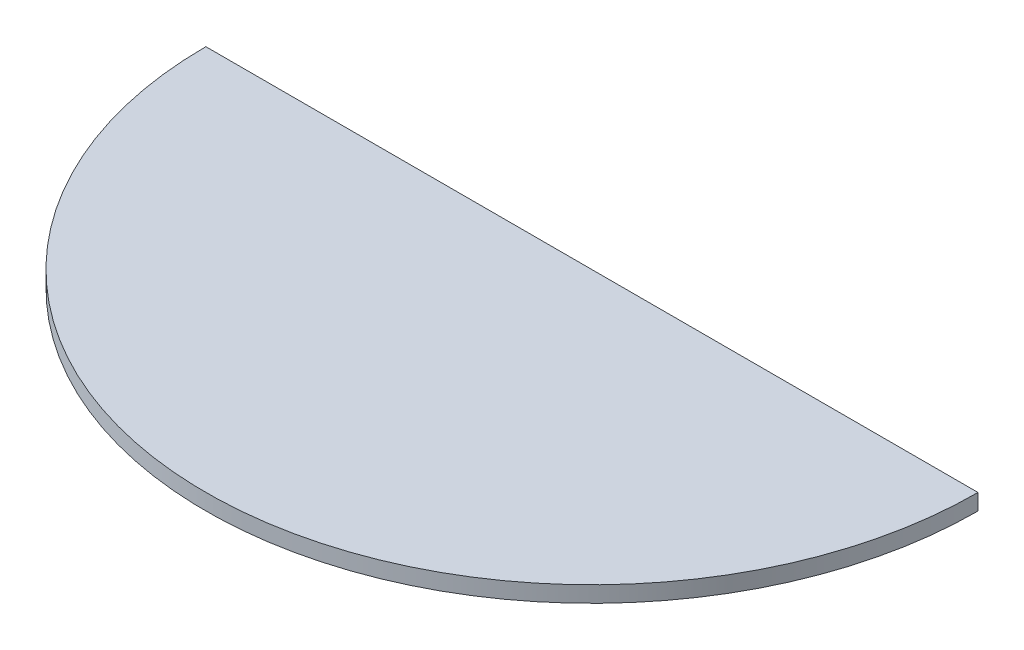
ISO-10303-21;
HEADER;
FILE_DESCRIPTION(('STEP AP214'),'2;1');
FILE_NAME('part.step','',(''),(''),'','','');
FILE_SCHEMA(('AUTOMOTIVE_DESIGN { 1 0 10303 214 1 1 1 1 }'));
ENDSEC;
DATA;
#1=APPLICATION_CONTEXT('core data for automotive mechanical design processes');
#2=APPLICATION_PROTOCOL_DEFINITION('international standard','automotive_design',2000,#1);
#3=PRODUCT_CONTEXT('',#1,'mechanical');
#4=PRODUCT('Part','Part','',(#3));
#5=PRODUCT_RELATED_PRODUCT_CATEGORY('part','',(#4));
#6=PRODUCT_DEFINITION_FORMATION('','',#4);
#7=PRODUCT_DEFINITION_CONTEXT('part definition',#1,'design');
#8=PRODUCT_DEFINITION('design','',#6,#7);
#9=PRODUCT_DEFINITION_SHAPE('','',#8);
#10=(LENGTH_UNIT() NAMED_UNIT(*) SI_UNIT(.MILLI.,.METRE.));
#11=(NAMED_UNIT(*) PLANE_ANGLE_UNIT() SI_UNIT($,.RADIAN.));
#12=(NAMED_UNIT(*) SI_UNIT($,.STERADIAN.) SOLID_ANGLE_UNIT());
#13=UNCERTAINTY_MEASURE_WITH_UNIT(LENGTH_MEASURE(1.E-05),#10,'distance_accuracy_value','');
#14=(GEOMETRIC_REPRESENTATION_CONTEXT(3) GLOBAL_UNCERTAINTY_ASSIGNED_CONTEXT((#13)) GLOBAL_UNIT_ASSIGNED_CONTEXT((#10,
#11,#12)) REPRESENTATION_CONTEXT('',''));
#15=CARTESIAN_POINT('',(0.,0.,0.));
#16=DIRECTION('',(0.,0.,1.));
#17=DIRECTION('',(1.,0.,0.));
#18=AXIS2_PLACEMENT_3D('',#15,#16,#17);
#19=CARTESIAN_POINT('',(152.4,0.,-1.06420351207939E-12));
#20=DIRECTION('',(0.,1.,0.));
#21=DIRECTION('',(0.,0.,1.));
#22=AXIS2_PLACEMENT_3D('',#19,#20,#21);
#23=PLANE('',#22);
#24=CARTESIAN_POINT('',(0.,0.,0.));
#25=DIRECTION('',(0.,-1.,0.));
#26=DIRECTION('',(0.,0.,-1.));
#27=AXIS2_PLACEMENT_3D('',#24,#25,#26);
#28=CIRCLE('',#27,152.4);
#29=CARTESIAN_POINT('',(152.4,0.,-1.06420351207939E-12));
#30=VERTEX_POINT('',#29);
#31=CARTESIAN_POINT('',(-152.4,0.,0.));
#32=VERTEX_POINT('',#31);
#33=EDGE_CURVE('E11',#30,#32,#28,.T.);
#34=ORIENTED_EDGE('',*,*,#33,.T.);
#35=DIRECTION('',(-1.,0.,0.));
#36=VECTOR('',#35,1.);
#37=CARTESIAN_POINT('',(152.4,0.,-1.06420351207939E-12));
#38=LINE('',#37,#36);
#39=EDGE_CURVE('E80',#30,#32,#38,.T.);
#40=ORIENTED_EDGE('',*,*,#39,.F.);
#41=EDGE_LOOP('',(#34,#40));
#42=FACE_BOUND('',#41,.T.);
#43=ADVANCED_FACE('F45',(#42),#23,.F.);
#44=CARTESIAN_POINT('',(0.,0.,0.));
#45=DIRECTION('',(0.,-1.,0.));
#46=DIRECTION('',(0.,0.,-1.));
#47=AXIS2_PLACEMENT_3D('',#44,#45,#46);
#48=CYLINDRICAL_SURFACE('',#47,152.4);
#49=CARTESIAN_POINT('',(0.,6.35,0.));
#50=DIRECTION('',(0.,-1.,0.));
#51=DIRECTION('',(0.,0.,-1.));
#52=AXIS2_PLACEMENT_3D('',#49,#50,#51);
#53=CIRCLE('',#52,152.4);
#54=CARTESIAN_POINT('',(152.4,6.35,-1.06420351207939E-12));
#55=VERTEX_POINT('',#54);
#56=CARTESIAN_POINT('',(-152.4,6.35,0.));
#57=VERTEX_POINT('',#56);
#58=EDGE_CURVE('E53',#55,#57,#53,.T.);
#59=ORIENTED_EDGE('',*,*,#58,.T.);
#60=DIRECTION('',(0.,1.,0.));
#61=VECTOR('',#60,1.);
#62=CARTESIAN_POINT('',(-152.4,0.,0.));
#63=LINE('',#62,#61);
#64=EDGE_CURVE('E76',#32,#57,#63,.T.);
#65=ORIENTED_EDGE('',*,*,#64,.F.);
#66=ORIENTED_EDGE('',*,*,#33,.F.);
#67=DIRECTION('',(0.,1.,0.));
#68=VECTOR('',#67,1.);
#69=CARTESIAN_POINT('',(152.4,0.,-1.06420351207939E-12));
#70=LINE('',#69,#68);
#71=EDGE_CURVE('E75',#30,#55,#70,.T.);
#72=ORIENTED_EDGE('',*,*,#71,.T.);
#73=EDGE_LOOP('',(#59,#65,#66,#72));
#74=FACE_BOUND('',#73,.T.);
#75=ADVANCED_FACE('F78',(#74),#48,.T.);
#76=CARTESIAN_POINT('',(152.4,6.35,-1.06420351207939E-12));
#77=DIRECTION('',(0.,1.,0.));
#78=DIRECTION('',(0.,0.,1.));
#79=AXIS2_PLACEMENT_3D('',#76,#77,#78);
#80=PLANE('',#79);
#81=DIRECTION('',(-1.,0.,0.));
#82=VECTOR('',#81,1.);
#83=CARTESIAN_POINT('',(152.4,6.35,-1.06420351207939E-12));
#84=LINE('',#83,#82);
#85=EDGE_CURVE('E70',#55,#57,#84,.T.);
#86=ORIENTED_EDGE('',*,*,#85,.T.);
#87=ORIENTED_EDGE('',*,*,#58,.F.);
#88=EDGE_LOOP('',(#86,#87));
#89=FACE_BOUND('',#88,.T.);
#90=ADVANCED_FACE('F71',(#89),#80,.T.);
#91=CARTESIAN_POINT('',(0.,0.,0.));
#92=DIRECTION('',(0.,0.,1.));
#93=DIRECTION('',(1.,0.,0.));
#94=AXIS2_PLACEMENT_3D('',#91,#92,#93);
#95=PLANE('',#94);
#96=ORIENTED_EDGE('',*,*,#39,.T.);
#97=ORIENTED_EDGE('',*,*,#64,.T.);
#98=ORIENTED_EDGE('',*,*,#85,.F.);
#99=ORIENTED_EDGE('',*,*,#71,.F.);
#100=EDGE_LOOP('',(#96,#97,#98,#99));
#101=FACE_BOUND('',#100,.T.);
#102=ADVANCED_FACE('F81',(#101),#95,.F.);
#103=CLOSED_SHELL('',(#43,#75,#90,#102));
#104=MANIFOLD_SOLID_BREP('B2',#103);
#105=ADVANCED_BREP_SHAPE_REPRESENTATION('',(#18,#104),#14);
#106=SHAPE_DEFINITION_REPRESENTATION(#9,#105);
ENDSEC;
END-ISO-10303-21;
